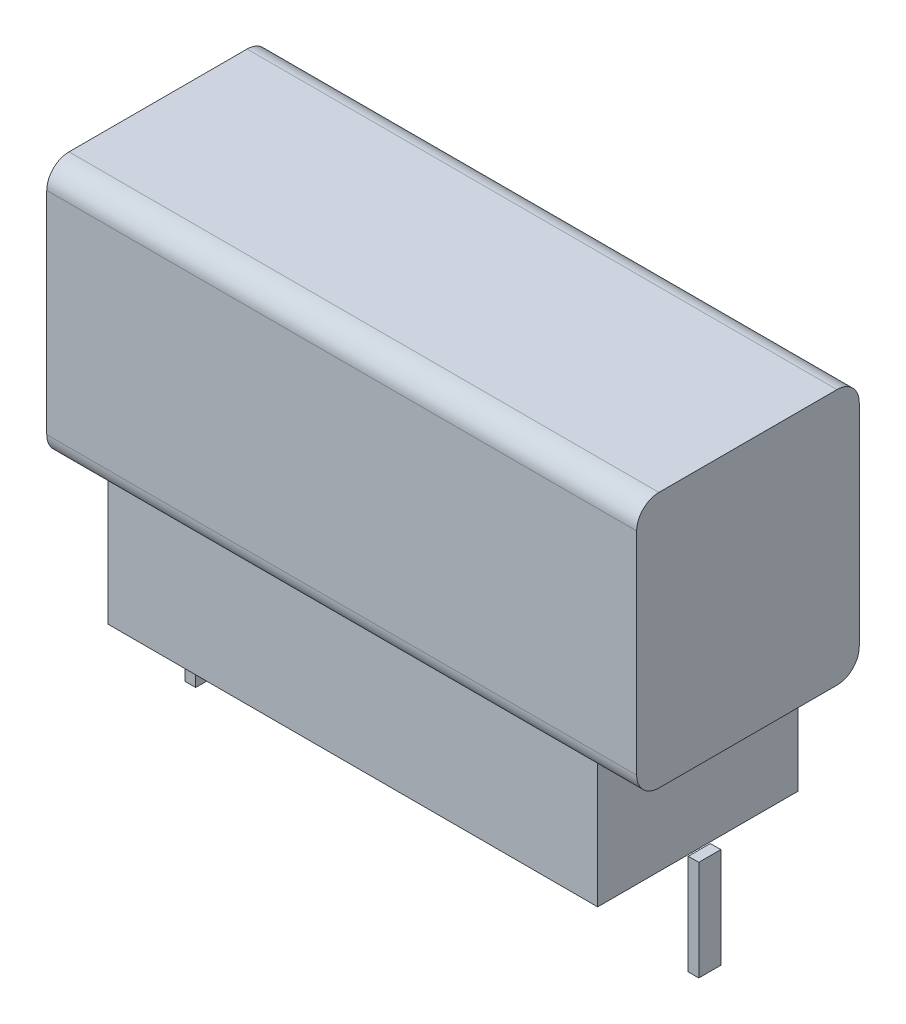
ISO-10303-21;
HEADER;
FILE_DESCRIPTION(('STEP AP214'),'2;1');
FILE_NAME('part.step','',(''),(''),'','','');
FILE_SCHEMA(('AUTOMOTIVE_DESIGN { 1 0 10303 214 1 1 1 1 }'));
ENDSEC;
DATA;
#1=APPLICATION_CONTEXT('core data for automotive mechanical design processes');
#2=APPLICATION_PROTOCOL_DEFINITION('international standard','automotive_design',2000,#1);
#3=PRODUCT_CONTEXT('',#1,'mechanical');
#4=PRODUCT('Part','Part','',(#3));
#5=PRODUCT_RELATED_PRODUCT_CATEGORY('part','',(#4));
#6=PRODUCT_DEFINITION_FORMATION('','',#4);
#7=PRODUCT_DEFINITION_CONTEXT('part definition',#1,'design');
#8=PRODUCT_DEFINITION('design','',#6,#7);
#9=PRODUCT_DEFINITION_SHAPE('','',#8);
#10=(LENGTH_UNIT() NAMED_UNIT(*) SI_UNIT(.MILLI.,.METRE.));
#11=(NAMED_UNIT(*) PLANE_ANGLE_UNIT() SI_UNIT($,.RADIAN.));
#12=(NAMED_UNIT(*) SI_UNIT($,.STERADIAN.) SOLID_ANGLE_UNIT());
#13=UNCERTAINTY_MEASURE_WITH_UNIT(LENGTH_MEASURE(1.E-05),#10,'distance_accuracy_value','');
#14=(GEOMETRIC_REPRESENTATION_CONTEXT(3) GLOBAL_UNCERTAINTY_ASSIGNED_CONTEXT((#13)) GLOBAL_UNIT_ASSIGNED_CONTEXT((#10,
#11,#12)) REPRESENTATION_CONTEXT('',''));
#15=CARTESIAN_POINT('',(0.,0.,0.));
#16=DIRECTION('',(0.,0.,1.));
#17=DIRECTION('',(1.,0.,0.));
#18=AXIS2_PLACEMENT_3D('',#15,#16,#17);
#19=CARTESIAN_POINT('',(11.063419677818,-4.5,0.495781560043111));
#20=DIRECTION('',(0.,0.,-1.));
#21=DIRECTION('',(-1.,0.,0.));
#22=AXIS2_PLACEMENT_3D('',#19,#20,#21);
#23=PLANE('',#22);
#24=DIRECTION('',(-1.,0.,0.));
#25=VECTOR('',#24,1.);
#26=CARTESIAN_POINT('',(11.063419677818,0.,0.495781560043111));
#27=LINE('',#26,#25);
#28=CARTESIAN_POINT('',(11.536580322182,0.,0.495781560043111));
#29=VERTEX_POINT('',#28);
#30=CARTESIAN_POINT('',(11.063419677818,0.,0.495781560043111));
#31=VERTEX_POINT('',#30);
#32=EDGE_CURVE('E107',#29,#31,#27,.T.);
#33=ORIENTED_EDGE('',*,*,#32,.T.);
#34=DIRECTION('',(0.,1.,0.));
#35=VECTOR('',#34,1.);
#36=CARTESIAN_POINT('',(11.063419677818,-4.5,0.495781560043111));
#37=LINE('',#36,#35);
#38=CARTESIAN_POINT('',(11.063419677818,-4.5,0.495781560043111));
#39=VERTEX_POINT('',#38);
#40=EDGE_CURVE('E12',#39,#31,#37,.T.);
#41=ORIENTED_EDGE('',*,*,#40,.F.);
#42=DIRECTION('',(-1.,0.,0.));
#43=VECTOR('',#42,1.);
#44=CARTESIAN_POINT('',(11.063419677818,-4.5,0.495781560043111));
#45=LINE('',#44,#43);
#46=CARTESIAN_POINT('',(11.536580322182,-4.5,0.495781560043111));
#47=VERTEX_POINT('',#46);
#48=EDGE_CURVE('E95',#47,#39,#45,.T.);
#49=ORIENTED_EDGE('',*,*,#48,.F.);
#50=DIRECTION('',(0.,1.,0.));
#51=VECTOR('',#50,1.);
#52=CARTESIAN_POINT('',(11.536580322182,-4.5,0.495781560043111));
#53=LINE('',#52,#51);
#54=EDGE_CURVE('E103',#47,#29,#53,.T.);
#55=ORIENTED_EDGE('',*,*,#54,.T.);
#56=EDGE_LOOP('',(#33,#41,#49,#55));
#57=FACE_BOUND('',#56,.T.);
#58=ADVANCED_FACE('F44',(#57),#23,.F.);
#59=CARTESIAN_POINT('',(11.063419677818,-4.5,0.495781560043111));
#60=DIRECTION('',(1.,0.,0.));
#61=DIRECTION('',(0.,0.,-1.));
#62=AXIS2_PLACEMENT_3D('',#59,#60,#61);
#63=PLANE('',#62);
#64=DIRECTION('',(0.,0.,-1.));
#65=VECTOR('',#64,1.);
#66=CARTESIAN_POINT('',(11.063419677818,0.,0.495781560043111));
#67=LINE('',#66,#65);
#68=CARTESIAN_POINT('',(11.063419677818,0.,-0.495781560043111));
#69=VERTEX_POINT('',#68);
#70=EDGE_CURVE('E99',#31,#69,#67,.T.);
#71=ORIENTED_EDGE('',*,*,#70,.T.);
#72=DIRECTION('',(0.,1.,0.));
#73=VECTOR('',#72,1.);
#74=CARTESIAN_POINT('',(11.063419677818,-4.5,-0.495781560043111));
#75=LINE('',#74,#73);
#76=CARTESIAN_POINT('',(11.063419677818,-4.5,-0.495781560043111));
#77=VERTEX_POINT('',#76);
#78=EDGE_CURVE('E52',#77,#69,#75,.T.);
#79=ORIENTED_EDGE('',*,*,#78,.F.);
#80=DIRECTION('',(0.,0.,-1.));
#81=VECTOR('',#80,1.);
#82=CARTESIAN_POINT('',(11.063419677818,-4.5,0.495781560043111));
#83=LINE('',#82,#81);
#84=EDGE_CURVE('E90',#39,#77,#83,.T.);
#85=ORIENTED_EDGE('',*,*,#84,.F.);
#86=ORIENTED_EDGE('',*,*,#40,.T.);
#87=EDGE_LOOP('',(#71,#79,#85,#86));
#88=FACE_BOUND('',#87,.T.);
#89=ADVANCED_FACE('F98',(#88),#63,.F.);
#90=CARTESIAN_POINT('',(11.063419677818,-4.5,-0.495781560043111));
#91=DIRECTION('',(0.,0.,1.));
#92=DIRECTION('',(1.,0.,0.));
#93=AXIS2_PLACEMENT_3D('',#90,#91,#92);
#94=PLANE('',#93);
#95=DIRECTION('',(1.,0.,0.));
#96=VECTOR('',#95,1.);
#97=CARTESIAN_POINT('',(11.063419677818,0.,-0.495781560043111));
#98=LINE('',#97,#96);
#99=CARTESIAN_POINT('',(11.536580322182,0.,-0.495781560043111));
#100=VERTEX_POINT('',#99);
#101=EDGE_CURVE('E77',#69,#100,#98,.T.);
#102=ORIENTED_EDGE('',*,*,#101,.T.);
#103=DIRECTION('',(0.,1.,0.));
#104=VECTOR('',#103,1.);
#105=CARTESIAN_POINT('',(11.536580322182,-4.5,-0.495781560043111));
#106=LINE('',#105,#104);
#107=CARTESIAN_POINT('',(11.536580322182,-4.5,-0.495781560043111));
#108=VERTEX_POINT('',#107);
#109=EDGE_CURVE('E100',#108,#100,#106,.T.);
#110=ORIENTED_EDGE('',*,*,#109,.F.);
#111=DIRECTION('',(1.,0.,0.));
#112=VECTOR('',#111,1.);
#113=CARTESIAN_POINT('',(11.063419677818,-4.5,-0.495781560043111));
#114=LINE('',#113,#112);
#115=EDGE_CURVE('E93',#77,#108,#114,.T.);
#116=ORIENTED_EDGE('',*,*,#115,.F.);
#117=ORIENTED_EDGE('',*,*,#78,.T.);
#118=EDGE_LOOP('',(#102,#110,#116,#117));
#119=FACE_BOUND('',#118,.T.);
#120=ADVANCED_FACE('F101',(#119),#94,.F.);
#121=CARTESIAN_POINT('',(11.536580322182,-4.5,0.495781560043111));
#122=DIRECTION('',(-1.,0.,0.));
#123=DIRECTION('',(0.,0.,1.));
#124=AXIS2_PLACEMENT_3D('',#121,#122,#123);
#125=PLANE('',#124);
#126=DIRECTION('',(0.,0.,1.));
#127=VECTOR('',#126,1.);
#128=CARTESIAN_POINT('',(11.536580322182,0.,0.495781560043111));
#129=LINE('',#128,#127);
#130=EDGE_CURVE('E83',#100,#29,#129,.T.);
#131=ORIENTED_EDGE('',*,*,#130,.T.);
#132=ORIENTED_EDGE('',*,*,#54,.F.);
#133=DIRECTION('',(0.,0.,1.));
#134=VECTOR('',#133,1.);
#135=CARTESIAN_POINT('',(11.536580322182,-4.5,0.495781560043111));
#136=LINE('',#135,#134);
#137=EDGE_CURVE('E60',#108,#47,#136,.T.);
#138=ORIENTED_EDGE('',*,*,#137,.F.);
#139=ORIENTED_EDGE('',*,*,#109,.T.);
#140=EDGE_LOOP('',(#131,#132,#138,#139));
#141=FACE_BOUND('',#140,.T.);
#142=ADVANCED_FACE('F114',(#141),#125,.F.);
#143=CARTESIAN_POINT('',(0.,-4.5,0.));
#144=DIRECTION('',(0.,1.,0.));
#145=DIRECTION('',(0.,0.,1.));
#146=AXIS2_PLACEMENT_3D('',#143,#144,#145);
#147=PLANE('',#146);
#148=ORIENTED_EDGE('',*,*,#48,.T.);
#149=ORIENTED_EDGE('',*,*,#84,.T.);
#150=ORIENTED_EDGE('',*,*,#115,.T.);
#151=ORIENTED_EDGE('',*,*,#137,.T.);
#152=EDGE_LOOP('',(#148,#149,#150,#151));
#153=FACE_BOUND('',#152,.T.);
#154=ADVANCED_FACE('F91',(#153),#147,.F.);
#155=CARTESIAN_POINT('',(0.,0.,0.));
#156=DIRECTION('',(0.,1.,0.));
#157=DIRECTION('',(0.,0.,1.));
#158=AXIS2_PLACEMENT_3D('',#155,#156,#157);
#159=PLANE('',#158);
#160=ORIENTED_EDGE('',*,*,#32,.F.);
#161=ORIENTED_EDGE('',*,*,#130,.F.);
#162=ORIENTED_EDGE('',*,*,#101,.F.);
#163=ORIENTED_EDGE('',*,*,#70,.F.);
#164=EDGE_LOOP('',(#160,#161,#162,#163));
#165=FACE_BOUND('',#164,.T.);
#166=ADVANCED_FACE('F117',(#165),#159,.T.);
#167=CLOSED_SHELL('',(#58,#89,#120,#142,#154,#166));
#168=MANIFOLD_SOLID_BREP('B2',#167);
#169=CARTESIAN_POINT('',(-11.063419677818,-4.5,0.495781560043111));
#170=DIRECTION('',(-1.,0.,0.));
#171=DIRECTION('',(0.,0.,1.));
#172=AXIS2_PLACEMENT_3D('',#169,#170,#171);
#173=PLANE('',#172);
#174=DIRECTION('',(0.,0.,1.));
#175=VECTOR('',#174,1.);
#176=CARTESIAN_POINT('',(-11.063419677818,0.,0.495781560043111));
#177=LINE('',#176,#175);
#178=CARTESIAN_POINT('',(-11.063419677818,0.,-0.495781560043111));
#179=VERTEX_POINT('',#178);
#180=CARTESIAN_POINT('',(-11.063419677818,0.,0.495781560043111));
#181=VERTEX_POINT('',#180);
#182=EDGE_CURVE('E241',#179,#181,#177,.T.);
#183=ORIENTED_EDGE('',*,*,#182,.T.);
#184=DIRECTION('',(0.,1.,0.));
#185=VECTOR('',#184,1.);
#186=CARTESIAN_POINT('',(-11.063419677818,-4.5,0.495781560043111));
#187=LINE('',#186,#185);
#188=CARTESIAN_POINT('',(-11.063419677818,-4.5,0.495781560043111));
#189=VERTEX_POINT('',#188);
#190=EDGE_CURVE('E42',#189,#181,#187,.T.);
#191=ORIENTED_EDGE('',*,*,#190,.F.);
#192=DIRECTION('',(0.,0.,1.));
#193=VECTOR('',#192,1.);
#194=CARTESIAN_POINT('',(-11.063419677818,-4.5,0.495781560043111));
#195=LINE('',#194,#193);
#196=CARTESIAN_POINT('',(-11.063419677818,-4.5,-0.495781560043111));
#197=VERTEX_POINT('',#196);
#198=EDGE_CURVE('E229',#197,#189,#195,.T.);
#199=ORIENTED_EDGE('',*,*,#198,.F.);
#200=DIRECTION('',(0.,1.,0.));
#201=VECTOR('',#200,1.);
#202=CARTESIAN_POINT('',(-11.063419677818,-4.5,-0.495781560043111));
#203=LINE('',#202,#201);
#204=EDGE_CURVE('E237',#197,#179,#203,.T.);
#205=ORIENTED_EDGE('',*,*,#204,.T.);
#206=EDGE_LOOP('',(#183,#191,#199,#205));
#207=FACE_BOUND('',#206,.T.);
#208=ADVANCED_FACE('F178',(#207),#173,.F.);
#209=CARTESIAN_POINT('',(-11.063419677818,-4.5,0.495781560043111));
#210=DIRECTION('',(0.,0.,-1.));
#211=DIRECTION('',(-1.,0.,0.));
#212=AXIS2_PLACEMENT_3D('',#209,#210,#211);
#213=PLANE('',#212);
#214=DIRECTION('',(-1.,0.,0.));
#215=VECTOR('',#214,1.);
#216=CARTESIAN_POINT('',(-11.063419677818,0.,0.495781560043111));
#217=LINE('',#216,#215);
#218=CARTESIAN_POINT('',(-11.536580322182,0.,0.495781560043111));
#219=VERTEX_POINT('',#218);
#220=EDGE_CURVE('E233',#181,#219,#217,.T.);
#221=ORIENTED_EDGE('',*,*,#220,.T.);
#222=DIRECTION('',(0.,1.,0.));
#223=VECTOR('',#222,1.);
#224=CARTESIAN_POINT('',(-11.536580322182,-4.5,0.495781560043111));
#225=LINE('',#224,#223);
#226=CARTESIAN_POINT('',(-11.536580322182,-4.5,0.495781560043111));
#227=VERTEX_POINT('',#226);
#228=EDGE_CURVE('E186',#227,#219,#225,.T.);
#229=ORIENTED_EDGE('',*,*,#228,.F.);
#230=DIRECTION('',(-1.,0.,0.));
#231=VECTOR('',#230,1.);
#232=CARTESIAN_POINT('',(-11.063419677818,-4.5,0.495781560043111));
#233=LINE('',#232,#231);
#234=EDGE_CURVE('E224',#189,#227,#233,.T.);
#235=ORIENTED_EDGE('',*,*,#234,.F.);
#236=ORIENTED_EDGE('',*,*,#190,.T.);
#237=EDGE_LOOP('',(#221,#229,#235,#236));
#238=FACE_BOUND('',#237,.T.);
#239=ADVANCED_FACE('F232',(#238),#213,.F.);
#240=CARTESIAN_POINT('',(-11.536580322182,-4.5,0.495781560043111));
#241=DIRECTION('',(1.,0.,0.));
#242=DIRECTION('',(0.,0.,-1.));
#243=AXIS2_PLACEMENT_3D('',#240,#241,#242);
#244=PLANE('',#243);
#245=DIRECTION('',(0.,0.,-1.));
#246=VECTOR('',#245,1.);
#247=CARTESIAN_POINT('',(-11.536580322182,0.,0.495781560043111));
#248=LINE('',#247,#246);
#249=CARTESIAN_POINT('',(-11.536580322182,0.,-0.495781560043111));
#250=VERTEX_POINT('',#249);
#251=EDGE_CURVE('E211',#219,#250,#248,.T.);
#252=ORIENTED_EDGE('',*,*,#251,.T.);
#253=DIRECTION('',(0.,1.,0.));
#254=VECTOR('',#253,1.);
#255=CARTESIAN_POINT('',(-11.536580322182,-4.5,-0.495781560043111));
#256=LINE('',#255,#254);
#257=CARTESIAN_POINT('',(-11.536580322182,-4.5,-0.495781560043111));
#258=VERTEX_POINT('',#257);
#259=EDGE_CURVE('E234',#258,#250,#256,.T.);
#260=ORIENTED_EDGE('',*,*,#259,.F.);
#261=DIRECTION('',(0.,0.,-1.));
#262=VECTOR('',#261,1.);
#263=CARTESIAN_POINT('',(-11.536580322182,-4.5,0.495781560043111));
#264=LINE('',#263,#262);
#265=EDGE_CURVE('E227',#227,#258,#264,.T.);
#266=ORIENTED_EDGE('',*,*,#265,.F.);
#267=ORIENTED_EDGE('',*,*,#228,.T.);
#268=EDGE_LOOP('',(#252,#260,#266,#267));
#269=FACE_BOUND('',#268,.T.);
#270=ADVANCED_FACE('F235',(#269),#244,.F.);
#271=CARTESIAN_POINT('',(-11.063419677818,-4.5,-0.495781560043111));
#272=DIRECTION('',(0.,0.,1.));
#273=DIRECTION('',(1.,0.,0.));
#274=AXIS2_PLACEMENT_3D('',#271,#272,#273);
#275=PLANE('',#274);
#276=DIRECTION('',(1.,0.,0.));
#277=VECTOR('',#276,1.);
#278=CARTESIAN_POINT('',(-11.063419677818,0.,-0.495781560043111));
#279=LINE('',#278,#277);
#280=EDGE_CURVE('E217',#250,#179,#279,.T.);
#281=ORIENTED_EDGE('',*,*,#280,.T.);
#282=ORIENTED_EDGE('',*,*,#204,.F.);
#283=DIRECTION('',(1.,0.,0.));
#284=VECTOR('',#283,1.);
#285=CARTESIAN_POINT('',(-11.063419677818,-4.5,-0.495781560043111));
#286=LINE('',#285,#284);
#287=EDGE_CURVE('E194',#258,#197,#286,.T.);
#288=ORIENTED_EDGE('',*,*,#287,.F.);
#289=ORIENTED_EDGE('',*,*,#259,.T.);
#290=EDGE_LOOP('',(#281,#282,#288,#289));
#291=FACE_BOUND('',#290,.T.);
#292=ADVANCED_FACE('F248',(#291),#275,.F.);
#293=CARTESIAN_POINT('',(0.,-4.5,0.));
#294=DIRECTION('',(0.,1.,0.));
#295=DIRECTION('',(0.,0.,1.));
#296=AXIS2_PLACEMENT_3D('',#293,#294,#295);
#297=PLANE('',#296);
#298=ORIENTED_EDGE('',*,*,#198,.T.);
#299=ORIENTED_EDGE('',*,*,#234,.T.);
#300=ORIENTED_EDGE('',*,*,#265,.T.);
#301=ORIENTED_EDGE('',*,*,#287,.T.);
#302=EDGE_LOOP('',(#298,#299,#300,#301));
#303=FACE_BOUND('',#302,.T.);
#304=ADVANCED_FACE('F225',(#303),#297,.F.);
#305=CARTESIAN_POINT('',(0.,0.,0.));
#306=DIRECTION('',(0.,1.,0.));
#307=DIRECTION('',(0.,0.,1.));
#308=AXIS2_PLACEMENT_3D('',#305,#306,#307);
#309=PLANE('',#308);
#310=ORIENTED_EDGE('',*,*,#182,.F.);
#311=ORIENTED_EDGE('',*,*,#280,.F.);
#312=ORIENTED_EDGE('',*,*,#251,.F.);
#313=ORIENTED_EDGE('',*,*,#220,.F.);
#314=EDGE_LOOP('',(#310,#311,#312,#313));
#315=FACE_BOUND('',#314,.T.);
#316=ADVANCED_FACE('F251',(#315),#309,.T.);
#317=CLOSED_SHELL('',(#208,#239,#270,#292,#304,#316));
#318=MANIFOLD_SOLID_BREP('B6',#317);
#319=CARTESIAN_POINT('',(0.,5.5,0.));
#320=DIRECTION('',(0.,1.,0.));
#321=DIRECTION('',(0.,0.,1.));
#322=AXIS2_PLACEMENT_3D('',#319,#320,#321);
#323=PLANE('',#322);
#324=DIRECTION('',(0.,0.,-1.));
#325=VECTOR('',#324,1.);
#326=CARTESIAN_POINT('',(13.25,5.5,-5.));
#327=LINE('',#326,#325);
#328=CARTESIAN_POINT('',(13.25,5.5,4.));
#329=VERTEX_POINT('',#328);
#330=CARTESIAN_POINT('',(13.25,5.5,-4.));
#331=VERTEX_POINT('',#330);
#332=EDGE_CURVE('E514',#329,#331,#327,.T.);
#333=ORIENTED_EDGE('',*,*,#332,.F.);
#334=DIRECTION('',(1.,0.,0.));
#335=VECTOR('',#334,1.);
#336=CARTESIAN_POINT('',(0.,5.5,4.));
#337=LINE('',#336,#335);
#338=CARTESIAN_POINT('',(11.,5.5,4.));
#339=VERTEX_POINT('',#338);
#340=EDGE_CURVE('E458',#329,#339,#337,.F.);
#341=ORIENTED_EDGE('',*,*,#340,.T.);
#342=DIRECTION('',(0.,0.,-1.));
#343=VECTOR('',#342,1.);
#344=CARTESIAN_POINT('',(11.,5.5,-4.5));
#345=LINE('',#344,#343);
#346=CARTESIAN_POINT('',(11.,5.5,-4.));
#347=VERTEX_POINT('',#346);
#348=EDGE_CURVE('E430',#339,#347,#345,.T.);
#349=ORIENTED_EDGE('',*,*,#348,.T.);
#350=DIRECTION('',(-1.,0.,0.));
#351=VECTOR('',#350,1.);
#352=CARTESIAN_POINT('',(0.,5.5,-4.));
#353=LINE('',#352,#351);
#354=EDGE_CURVE('E452',#347,#331,#353,.F.);
#355=ORIENTED_EDGE('',*,*,#354,.T.);
#356=EDGE_LOOP('',(#333,#341,#349,#355));
#357=FACE_BOUND('',#356,.T.);
#358=ADVANCED_FACE('F303',(#357),#323,.F.);
#359=CARTESIAN_POINT('',(-11.,5.5,-4.5));
#360=DIRECTION('',(1.,0.,0.));
#361=DIRECTION('',(0.,0.,-1.));
#362=AXIS2_PLACEMENT_3D('',#359,#360,#361);
#363=PLANE('',#362);
#364=DIRECTION('',(0.,0.,1.));
#365=VECTOR('',#364,1.);
#366=CARTESIAN_POINT('',(-11.,0.,-4.5));
#367=LINE('',#366,#365);
#368=CARTESIAN_POINT('',(-11.,0.,-4.5));
#369=VERTEX_POINT('',#368);
#370=CARTESIAN_POINT('',(-11.,0.,4.5));
#371=VERTEX_POINT('',#370);
#372=EDGE_CURVE('E408',#369,#371,#367,.T.);
#373=ORIENTED_EDGE('',*,*,#372,.T.);
#374=DIRECTION('',(0.,-1.,0.));
#375=VECTOR('',#374,1.);
#376=CARTESIAN_POINT('',(-11.,5.5,4.5));
#377=LINE('',#376,#375);
#378=CARTESIAN_POINT('',(-11.,5.63397459621556,4.5));
#379=VERTEX_POINT('',#378);
#380=EDGE_CURVE('E414',#379,#371,#377,.T.);
#381=ORIENTED_EDGE('',*,*,#380,.F.);
#382=CARTESIAN_POINT('',(-11.,6.5,4.));
#383=DIRECTION('',(1.,0.,0.));
#384=DIRECTION('',(0.,0.,-1.));
#385=AXIS2_PLACEMENT_3D('',#382,#383,#384);
#386=CIRCLE('',#385,1.);
#387=CARTESIAN_POINT('',(-11.,5.5,4.));
#388=VERTEX_POINT('',#387);
#389=EDGE_CURVE('E483',#379,#388,#386,.T.);
#390=ORIENTED_EDGE('',*,*,#389,.T.);
#391=DIRECTION('',(0.,0.,1.));
#392=VECTOR('',#391,1.);
#393=CARTESIAN_POINT('',(-11.,5.5,-4.5));
#394=LINE('',#393,#392);
#395=CARTESIAN_POINT('',(-11.,5.5,-4.));
#396=VERTEX_POINT('',#395);
#397=EDGE_CURVE('E436',#396,#388,#394,.T.);
#398=ORIENTED_EDGE('',*,*,#397,.F.);
#399=CARTESIAN_POINT('',(-11.,6.5,-4.));
#400=DIRECTION('',(1.,0.,0.));
#401=DIRECTION('',(0.,0.,-1.));
#402=AXIS2_PLACEMENT_3D('',#399,#400,#401);
#403=CIRCLE('',#402,1.);
#404=CARTESIAN_POINT('',(-11.,5.63397459621556,-4.5));
#405=VERTEX_POINT('',#404);
#406=EDGE_CURVE('E485',#396,#405,#403,.T.);
#407=ORIENTED_EDGE('',*,*,#406,.T.);
#408=DIRECTION('',(0.,-1.,0.));
#409=VECTOR('',#408,1.);
#410=CARTESIAN_POINT('',(-11.,5.5,-4.5));
#411=LINE('',#410,#409);
#412=EDGE_CURVE('E324',#405,#369,#411,.T.);
#413=ORIENTED_EDGE('',*,*,#412,.T.);
#414=EDGE_LOOP('',(#373,#381,#390,#398,#407,#413));
#415=FACE_BOUND('',#414,.T.);
#416=ADVANCED_FACE('F423',(#415),#363,.F.);
#417=CARTESIAN_POINT('',(-11.,5.5,4.5));
#418=DIRECTION('',(0.,0.,-1.));
#419=DIRECTION('',(-1.,0.,0.));
#420=AXIS2_PLACEMENT_3D('',#417,#418,#419);
#421=PLANE('',#420);
#422=DIRECTION('',(1.,0.,0.));
#423=VECTOR('',#422,1.);
#424=CARTESIAN_POINT('',(-11.,0.,4.5));
#425=LINE('',#424,#423);
#426=CARTESIAN_POINT('',(11.,0.,4.5));
#427=VERTEX_POINT('',#426);
#428=EDGE_CURVE('E403',#371,#427,#425,.T.);
#429=ORIENTED_EDGE('',*,*,#428,.T.);
#430=DIRECTION('',(0.,-1.,0.));
#431=VECTOR('',#430,1.);
#432=CARTESIAN_POINT('',(11.,5.5,4.5));
#433=LINE('',#432,#431);
#434=CARTESIAN_POINT('',(11.,5.63397459621556,4.5));
#435=VERTEX_POINT('',#434);
#436=EDGE_CURVE('E421',#435,#427,#433,.T.);
#437=ORIENTED_EDGE('',*,*,#436,.F.);
#438=DIRECTION('',(1.,0.,0.));
#439=VECTOR('',#438,1.);
#440=CARTESIAN_POINT('',(11.,5.63397459621556,4.5));
#441=LINE('',#440,#439);
#442=EDGE_CURVE('E417',#435,#379,#441,.F.);
#443=ORIENTED_EDGE('',*,*,#442,.T.);
#444=ORIENTED_EDGE('',*,*,#380,.T.);
#445=EDGE_LOOP('',(#429,#437,#443,#444));
#446=FACE_BOUND('',#445,.T.);
#447=ADVANCED_FACE('F415',(#446),#421,.F.);
#448=CARTESIAN_POINT('',(11.,5.5,-4.5));
#449=DIRECTION('',(-1.,0.,0.));
#450=DIRECTION('',(0.,0.,1.));
#451=AXIS2_PLACEMENT_3D('',#448,#449,#450);
#452=PLANE('',#451);
#453=DIRECTION('',(0.,0.,-1.));
#454=VECTOR('',#453,1.);
#455=CARTESIAN_POINT('',(11.,0.,-4.5));
#456=LINE('',#455,#454);
#457=CARTESIAN_POINT('',(11.,0.,-4.5));
#458=VERTEX_POINT('',#457);
#459=EDGE_CURVE('E409',#427,#458,#456,.T.);
#460=ORIENTED_EDGE('',*,*,#459,.T.);
#461=DIRECTION('',(0.,-1.,0.));
#462=VECTOR('',#461,1.);
#463=CARTESIAN_POINT('',(11.,5.5,-4.5));
#464=LINE('',#463,#462);
#465=CARTESIAN_POINT('',(11.,5.63397459621556,-4.5));
#466=VERTEX_POINT('',#465);
#467=EDGE_CURVE('E317',#466,#458,#464,.T.);
#468=ORIENTED_EDGE('',*,*,#467,.F.);
#469=CARTESIAN_POINT('',(11.,6.5,-4.));
#470=DIRECTION('',(-1.,0.,0.));
#471=DIRECTION('',(0.,0.,1.));
#472=AXIS2_PLACEMENT_3D('',#469,#470,#471);
#473=CIRCLE('',#472,1.);
#474=EDGE_CURVE('E176',#466,#347,#473,.T.);
#475=ORIENTED_EDGE('',*,*,#474,.T.);
#476=ORIENTED_EDGE('',*,*,#348,.F.);
#477=CARTESIAN_POINT('',(11.,6.5,4.));
#478=DIRECTION('',(-1.,0.,0.));
#479=DIRECTION('',(0.,0.,1.));
#480=AXIS2_PLACEMENT_3D('',#477,#478,#479);
#481=CIRCLE('',#480,1.);
#482=EDGE_CURVE('E479',#339,#435,#481,.T.);
#483=ORIENTED_EDGE('',*,*,#482,.T.);
#484=ORIENTED_EDGE('',*,*,#436,.T.);
#485=EDGE_LOOP('',(#460,#468,#475,#476,#483,#484));
#486=FACE_BOUND('',#485,.T.);
#487=ADVANCED_FACE('F496',(#486),#452,.F.);
#488=CARTESIAN_POINT('',(-11.,5.5,-4.5));
#489=DIRECTION('',(0.,0.,1.));
#490=DIRECTION('',(1.,0.,0.));
#491=AXIS2_PLACEMENT_3D('',#488,#489,#490);
#492=PLANE('',#491);
#493=DIRECTION('',(-1.,0.,0.));
#494=VECTOR('',#493,1.);
#495=CARTESIAN_POINT('',(-11.,0.,-4.5));
#496=LINE('',#495,#494);
#497=EDGE_CURVE('E434',#458,#369,#496,.T.);
#498=ORIENTED_EDGE('',*,*,#497,.T.);
#499=ORIENTED_EDGE('',*,*,#412,.F.);
#500=DIRECTION('',(-1.,0.,0.));
#501=VECTOR('',#500,1.);
#502=CARTESIAN_POINT('',(-11.,5.63397459621556,-4.5));
#503=LINE('',#502,#501);
#504=EDGE_CURVE('E311',#405,#466,#503,.F.);
#505=ORIENTED_EDGE('',*,*,#504,.T.);
#506=ORIENTED_EDGE('',*,*,#467,.T.);
#507=EDGE_LOOP('',(#498,#499,#505,#506));
#508=FACE_BOUND('',#507,.T.);
#509=ADVANCED_FACE('F488',(#508),#492,.F.);
#510=CARTESIAN_POINT('',(0.,0.,0.));
#511=DIRECTION('',(0.,1.,0.));
#512=DIRECTION('',(0.,0.,1.));
#513=AXIS2_PLACEMENT_3D('',#510,#511,#512);
#514=PLANE('',#513);
#515=ORIENTED_EDGE('',*,*,#372,.F.);
#516=ORIENTED_EDGE('',*,*,#497,.F.);
#517=ORIENTED_EDGE('',*,*,#459,.F.);
#518=ORIENTED_EDGE('',*,*,#428,.F.);
#519=EDGE_LOOP('',(#515,#516,#517,#518));
#520=FACE_BOUND('',#519,.T.);
#521=ADVANCED_FACE('F405',(#520),#514,.F.);
#522=ORIENTED_EDGE('',*,*,#397,.T.);
#523=DIRECTION('',(1.,0.,0.));
#524=VECTOR('',#523,1.);
#525=CARTESIAN_POINT('',(0.,5.5,4.));
#526=LINE('',#525,#524);
#527=CARTESIAN_POINT('',(-13.25,5.5,4.));
#528=VERTEX_POINT('',#527);
#529=EDGE_CURVE('E456',#388,#528,#526,.F.);
#530=ORIENTED_EDGE('',*,*,#529,.T.);
#531=DIRECTION('',(0.,0.,1.));
#532=VECTOR('',#531,1.);
#533=CARTESIAN_POINT('',(-13.25,5.5,-5.));
#534=LINE('',#533,#532);
#535=CARTESIAN_POINT('',(-13.25,5.5,-4.));
#536=VERTEX_POINT('',#535);
#537=EDGE_CURVE('E510',#536,#528,#534,.T.);
#538=ORIENTED_EDGE('',*,*,#537,.F.);
#539=DIRECTION('',(-1.,0.,0.));
#540=VECTOR('',#539,1.);
#541=CARTESIAN_POINT('',(0.,5.5,-4.));
#542=LINE('',#541,#540);
#543=EDGE_CURVE('E454',#536,#396,#542,.F.);
#544=ORIENTED_EDGE('',*,*,#543,.T.);
#545=EDGE_LOOP('',(#522,#530,#538,#544));
#546=FACE_BOUND('',#545,.T.);
#547=ADVANCED_FACE('F557',(#546),#323,.F.);
#548=CARTESIAN_POINT('',(-13.25,62.3240180765371,-5.));
#549=DIRECTION('',(1.,0.,0.));
#550=DIRECTION('',(0.,0.,-1.));
#551=AXIS2_PLACEMENT_3D('',#548,#549,#550);
#552=PLANE('',#551);
#553=ORIENTED_EDGE('',*,*,#537,.T.);
#554=CARTESIAN_POINT('',(-13.25,6.5,4.));
#555=DIRECTION('',(1.,0.,0.));
#556=DIRECTION('',(0.,0.,-1.));
#557=AXIS2_PLACEMENT_3D('',#554,#555,#556);
#558=CIRCLE('',#557,1.);
#559=CARTESIAN_POINT('',(-13.25,6.5,5.));
#560=VERTEX_POINT('',#559);
#561=EDGE_CURVE('E466',#528,#560,#558,.F.);
#562=ORIENTED_EDGE('',*,*,#561,.T.);
#563=DIRECTION('',(0.,-1.,0.));
#564=VECTOR('',#563,1.);
#565=CARTESIAN_POINT('',(-13.25,62.3240180765371,5.));
#566=LINE('',#565,#564);
#567=CARTESIAN_POINT('',(-13.25,16.,5.));
#568=VERTEX_POINT('',#567);
#569=EDGE_CURVE('E518',#568,#560,#566,.T.);
#570=ORIENTED_EDGE('',*,*,#569,.F.);
#571=CARTESIAN_POINT('',(-13.25,16.,4.));
#572=DIRECTION('',(1.,0.,0.));
#573=DIRECTION('',(0.,0.,-1.));
#574=AXIS2_PLACEMENT_3D('',#571,#572,#573);
#575=CIRCLE('',#574,1.);
#576=CARTESIAN_POINT('',(-13.25,17.,4.));
#577=VERTEX_POINT('',#576);
#578=EDGE_CURVE('E460',#568,#577,#575,.F.);
#579=ORIENTED_EDGE('',*,*,#578,.T.);
#580=DIRECTION('',(0.,0.,1.));
#581=VECTOR('',#580,1.);
#582=CARTESIAN_POINT('',(-13.25,17.,-5.));
#583=LINE('',#582,#581);
#584=CARTESIAN_POINT('',(-13.25,17.,-4.));
#585=VERTEX_POINT('',#584);
#586=EDGE_CURVE('E427',#585,#577,#583,.T.);
#587=ORIENTED_EDGE('',*,*,#586,.F.);
#588=CARTESIAN_POINT('',(-13.25,16.,-4.));
#589=DIRECTION('',(1.,0.,0.));
#590=DIRECTION('',(0.,0.,-1.));
#591=AXIS2_PLACEMENT_3D('',#588,#589,#590);
#592=CIRCLE('',#591,1.);
#593=CARTESIAN_POINT('',(-13.25,16.,-5.));
#594=VERTEX_POINT('',#593);
#595=EDGE_CURVE('E462',#585,#594,#592,.F.);
#596=ORIENTED_EDGE('',*,*,#595,.T.);
#597=DIRECTION('',(0.,-1.,0.));
#598=VECTOR('',#597,1.);
#599=CARTESIAN_POINT('',(-13.25,62.3240180765371,-5.));
#600=LINE('',#599,#598);
#601=CARTESIAN_POINT('',(-13.25,6.5,-5.));
#602=VERTEX_POINT('',#601);
#603=EDGE_CURVE('E507',#594,#602,#600,.T.);
#604=ORIENTED_EDGE('',*,*,#603,.T.);
#605=CARTESIAN_POINT('',(-13.25,6.5,-4.));
#606=DIRECTION('',(1.,0.,0.));
#607=DIRECTION('',(0.,0.,-1.));
#608=AXIS2_PLACEMENT_3D('',#605,#606,#607);
#609=CIRCLE('',#608,1.);
#610=EDGE_CURVE('E464',#602,#536,#609,.F.);
#611=ORIENTED_EDGE('',*,*,#610,.T.);
#612=EDGE_LOOP('',(#553,#562,#570,#579,#587,#596,#604,#611));
#613=FACE_BOUND('',#612,.T.);
#614=ADVANCED_FACE('F535',(#613),#552,.F.);
#615=CARTESIAN_POINT('',(-13.25,62.3240180765371,5.));
#616=DIRECTION('',(0.,0.,-1.));
#617=DIRECTION('',(-1.,0.,0.));
#618=AXIS2_PLACEMENT_3D('',#615,#616,#617);
#619=PLANE('',#618);
#620=ORIENTED_EDGE('',*,*,#569,.T.);
#621=DIRECTION('',(1.,0.,0.));
#622=VECTOR('',#621,1.);
#623=CARTESIAN_POINT('',(-13.25,6.5,5.));
#624=LINE('',#623,#622);
#625=CARTESIAN_POINT('',(13.25,6.5,5.));
#626=VERTEX_POINT('',#625);
#627=EDGE_CURVE('E441',#560,#626,#624,.T.);
#628=ORIENTED_EDGE('',*,*,#627,.T.);
#629=DIRECTION('',(0.,-1.,0.));
#630=VECTOR('',#629,1.);
#631=CARTESIAN_POINT('',(13.25,62.3240180765371,5.));
#632=LINE('',#631,#630);
#633=CARTESIAN_POINT('',(13.25,16.,5.));
#634=VERTEX_POINT('',#633);
#635=EDGE_CURVE('E515',#634,#626,#632,.T.);
#636=ORIENTED_EDGE('',*,*,#635,.F.);
#637=DIRECTION('',(1.,0.,0.));
#638=VECTOR('',#637,1.);
#639=CARTESIAN_POINT('',(-13.25,16.,5.));
#640=LINE('',#639,#638);
#641=EDGE_CURVE('E420',#634,#568,#640,.F.);
#642=ORIENTED_EDGE('',*,*,#641,.T.);
#643=EDGE_LOOP('',(#620,#628,#636,#642));
#644=FACE_BOUND('',#643,.T.);
#645=ADVANCED_FACE('F550',(#644),#619,.F.);
#646=CARTESIAN_POINT('',(13.25,62.3240180765371,-5.));
#647=DIRECTION('',(-1.,0.,0.));
#648=DIRECTION('',(0.,0.,1.));
#649=AXIS2_PLACEMENT_3D('',#646,#647,#648);
#650=PLANE('',#649);
#651=ORIENTED_EDGE('',*,*,#635,.T.);
#652=CARTESIAN_POINT('',(13.25,6.5,4.));
#653=DIRECTION('',(-1.,0.,0.));
#654=DIRECTION('',(0.,0.,1.));
#655=AXIS2_PLACEMENT_3D('',#652,#653,#654);
#656=CIRCLE('',#655,1.);
#657=EDGE_CURVE('E450',#626,#329,#656,.F.);
#658=ORIENTED_EDGE('',*,*,#657,.T.);
#659=ORIENTED_EDGE('',*,*,#332,.T.);
#660=CARTESIAN_POINT('',(13.25,6.5,-4.));
#661=DIRECTION('',(-1.,0.,0.));
#662=DIRECTION('',(0.,0.,1.));
#663=AXIS2_PLACEMENT_3D('',#660,#661,#662);
#664=CIRCLE('',#663,1.);
#665=CARTESIAN_POINT('',(13.25,6.5,-5.));
#666=VERTEX_POINT('',#665);
#667=EDGE_CURVE('E448',#331,#666,#664,.F.);
#668=ORIENTED_EDGE('',*,*,#667,.T.);
#669=DIRECTION('',(0.,-1.,0.));
#670=VECTOR('',#669,1.);
#671=CARTESIAN_POINT('',(13.25,62.3240180765371,-5.));
#672=LINE('',#671,#670);
#673=CARTESIAN_POINT('',(13.25,16.,-5.));
#674=VERTEX_POINT('',#673);
#675=EDGE_CURVE('E511',#674,#666,#672,.T.);
#676=ORIENTED_EDGE('',*,*,#675,.F.);
#677=CARTESIAN_POINT('',(13.25,16.,-4.));
#678=DIRECTION('',(-1.,0.,0.));
#679=DIRECTION('',(0.,0.,1.));
#680=AXIS2_PLACEMENT_3D('',#677,#678,#679);
#681=CIRCLE('',#680,1.);
#682=CARTESIAN_POINT('',(13.25,17.,-4.));
#683=VERTEX_POINT('',#682);
#684=EDGE_CURVE('E446',#674,#683,#681,.F.);
#685=ORIENTED_EDGE('',*,*,#684,.T.);
#686=DIRECTION('',(0.,0.,-1.));
#687=VECTOR('',#686,1.);
#688=CARTESIAN_POINT('',(13.25,17.,-5.));
#689=LINE('',#688,#687);
#690=CARTESIAN_POINT('',(13.25,17.,4.));
#691=VERTEX_POINT('',#690);
#692=EDGE_CURVE('E424',#691,#683,#689,.T.);
#693=ORIENTED_EDGE('',*,*,#692,.F.);
#694=CARTESIAN_POINT('',(13.25,16.,4.));
#695=DIRECTION('',(-1.,0.,0.));
#696=DIRECTION('',(0.,0.,1.));
#697=AXIS2_PLACEMENT_3D('',#694,#695,#696);
#698=CIRCLE('',#697,1.);
#699=EDGE_CURVE('E444',#691,#634,#698,.F.);
#700=ORIENTED_EDGE('',*,*,#699,.T.);
#701=EDGE_LOOP('',(#651,#658,#659,#668,#676,#685,#693,#700));
#702=FACE_BOUND('',#701,.T.);
#703=ADVANCED_FACE('F526',(#702),#650,.F.);
#704=CARTESIAN_POINT('',(-13.25,62.3240180765371,-5.));
#705=DIRECTION('',(0.,0.,1.));
#706=DIRECTION('',(1.,0.,0.));
#707=AXIS2_PLACEMENT_3D('',#704,#705,#706);
#708=PLANE('',#707);
#709=ORIENTED_EDGE('',*,*,#675,.T.);
#710=DIRECTION('',(-1.,0.,0.));
#711=VECTOR('',#710,1.);
#712=CARTESIAN_POINT('',(-13.25,6.5,-5.));
#713=LINE('',#712,#711);
#714=EDGE_CURVE('E470',#666,#602,#713,.T.);
#715=ORIENTED_EDGE('',*,*,#714,.T.);
#716=ORIENTED_EDGE('',*,*,#603,.F.);
#717=DIRECTION('',(-1.,0.,0.));
#718=VECTOR('',#717,1.);
#719=CARTESIAN_POINT('',(13.25,16.,-5.));
#720=LINE('',#719,#718);
#721=EDGE_CURVE('E468',#594,#674,#720,.F.);
#722=ORIENTED_EDGE('',*,*,#721,.T.);
#723=EDGE_LOOP('',(#709,#715,#716,#722));
#724=FACE_BOUND('',#723,.T.);
#725=ADVANCED_FACE('F532',(#724),#708,.F.);
#726=CARTESIAN_POINT('',(0.,17.,0.));
#727=DIRECTION('',(0.,1.,0.));
#728=DIRECTION('',(0.,0.,1.));
#729=AXIS2_PLACEMENT_3D('',#726,#727,#728);
#730=PLANE('',#729);
#731=ORIENTED_EDGE('',*,*,#692,.T.);
#732=DIRECTION('',(-1.,0.,0.));
#733=VECTOR('',#732,1.);
#734=CARTESIAN_POINT('',(-13.25,17.,-4.));
#735=LINE('',#734,#733);
#736=EDGE_CURVE('E476',#683,#585,#735,.T.);
#737=ORIENTED_EDGE('',*,*,#736,.T.);
#738=ORIENTED_EDGE('',*,*,#586,.T.);
#739=DIRECTION('',(1.,0.,0.));
#740=VECTOR('',#739,1.);
#741=CARTESIAN_POINT('',(13.25,17.,4.));
#742=LINE('',#741,#740);
#743=EDGE_CURVE('E473',#577,#691,#742,.T.);
#744=ORIENTED_EDGE('',*,*,#743,.T.);
#745=EDGE_LOOP('',(#731,#737,#738,#744));
#746=FACE_BOUND('',#745,.T.);
#747=ADVANCED_FACE('F543',(#746),#730,.T.);
#748=CARTESIAN_POINT('',(-13.25,6.5,4.));
#749=DIRECTION('',(1.,0.,0.));
#750=DIRECTION('',(0.,0.,-1.));
#751=AXIS2_PLACEMENT_3D('',#748,#749,#750);
#752=CYLINDRICAL_SURFACE('',#751,1.);
#753=ORIENTED_EDGE('',*,*,#482,.F.);
#754=ORIENTED_EDGE('',*,*,#340,.F.);
#755=ORIENTED_EDGE('',*,*,#657,.F.);
#756=ORIENTED_EDGE('',*,*,#627,.F.);
#757=ORIENTED_EDGE('',*,*,#561,.F.);
#758=ORIENTED_EDGE('',*,*,#529,.F.);
#759=ORIENTED_EDGE('',*,*,#389,.F.);
#760=ORIENTED_EDGE('',*,*,#442,.F.);
#761=EDGE_LOOP('',(#753,#754,#755,#756,#757,#758,#759,#760));
#762=FACE_BOUND('',#761,.T.);
#763=ADVANCED_FACE('F556',(#762),#752,.T.);
#764=CARTESIAN_POINT('',(-13.25,6.5,-4.));
#765=DIRECTION('',(-1.,0.,0.));
#766=DIRECTION('',(0.,0.,1.));
#767=AXIS2_PLACEMENT_3D('',#764,#765,#766);
#768=CYLINDRICAL_SURFACE('',#767,1.);
#769=ORIENTED_EDGE('',*,*,#406,.F.);
#770=ORIENTED_EDGE('',*,*,#543,.F.);
#771=ORIENTED_EDGE('',*,*,#610,.F.);
#772=ORIENTED_EDGE('',*,*,#714,.F.);
#773=ORIENTED_EDGE('',*,*,#667,.F.);
#774=ORIENTED_EDGE('',*,*,#354,.F.);
#775=ORIENTED_EDGE('',*,*,#474,.F.);
#776=ORIENTED_EDGE('',*,*,#504,.F.);
#777=EDGE_LOOP('',(#769,#770,#771,#772,#773,#774,#775,#776));
#778=FACE_BOUND('',#777,.T.);
#779=ADVANCED_FACE('F492',(#778),#768,.T.);
#780=CARTESIAN_POINT('',(0.,16.,-4.));
#781=DIRECTION('',(1.,0.,0.));
#782=DIRECTION('',(0.,0.,-1.));
#783=AXIS2_PLACEMENT_3D('',#780,#781,#782);
#784=CYLINDRICAL_SURFACE('',#783,1.);
#785=ORIENTED_EDGE('',*,*,#684,.F.);
#786=ORIENTED_EDGE('',*,*,#721,.F.);
#787=ORIENTED_EDGE('',*,*,#595,.F.);
#788=ORIENTED_EDGE('',*,*,#736,.F.);
#789=EDGE_LOOP('',(#785,#786,#787,#788));
#790=FACE_BOUND('',#789,.T.);
#791=ADVANCED_FACE('F541',(#790),#784,.T.);
#792=CARTESIAN_POINT('',(0.,16.,4.));
#793=DIRECTION('',(-1.,0.,0.));
#794=DIRECTION('',(0.,0.,1.));
#795=AXIS2_PLACEMENT_3D('',#792,#793,#794);
#796=CYLINDRICAL_SURFACE('',#795,1.);
#797=ORIENTED_EDGE('',*,*,#578,.F.);
#798=ORIENTED_EDGE('',*,*,#641,.F.);
#799=ORIENTED_EDGE('',*,*,#699,.F.);
#800=ORIENTED_EDGE('',*,*,#743,.F.);
#801=EDGE_LOOP('',(#797,#798,#799,#800));
#802=FACE_BOUND('',#801,.T.);
#803=ADVANCED_FACE('F305',(#802),#796,.T.);
#804=CLOSED_SHELL('',(#358,#416,#447,#487,#509,#521,#547,#614,#645,#703,#725,#747,#763,#779,
#791,#803));
#805=MANIFOLD_SOLID_BREP('B36',#804);
#806=ADVANCED_BREP_SHAPE_REPRESENTATION('',(#18,#168,#318,#805),#14);
#807=SHAPE_DEFINITION_REPRESENTATION(#9,#806);
ENDSEC;
END-ISO-10303-21;
